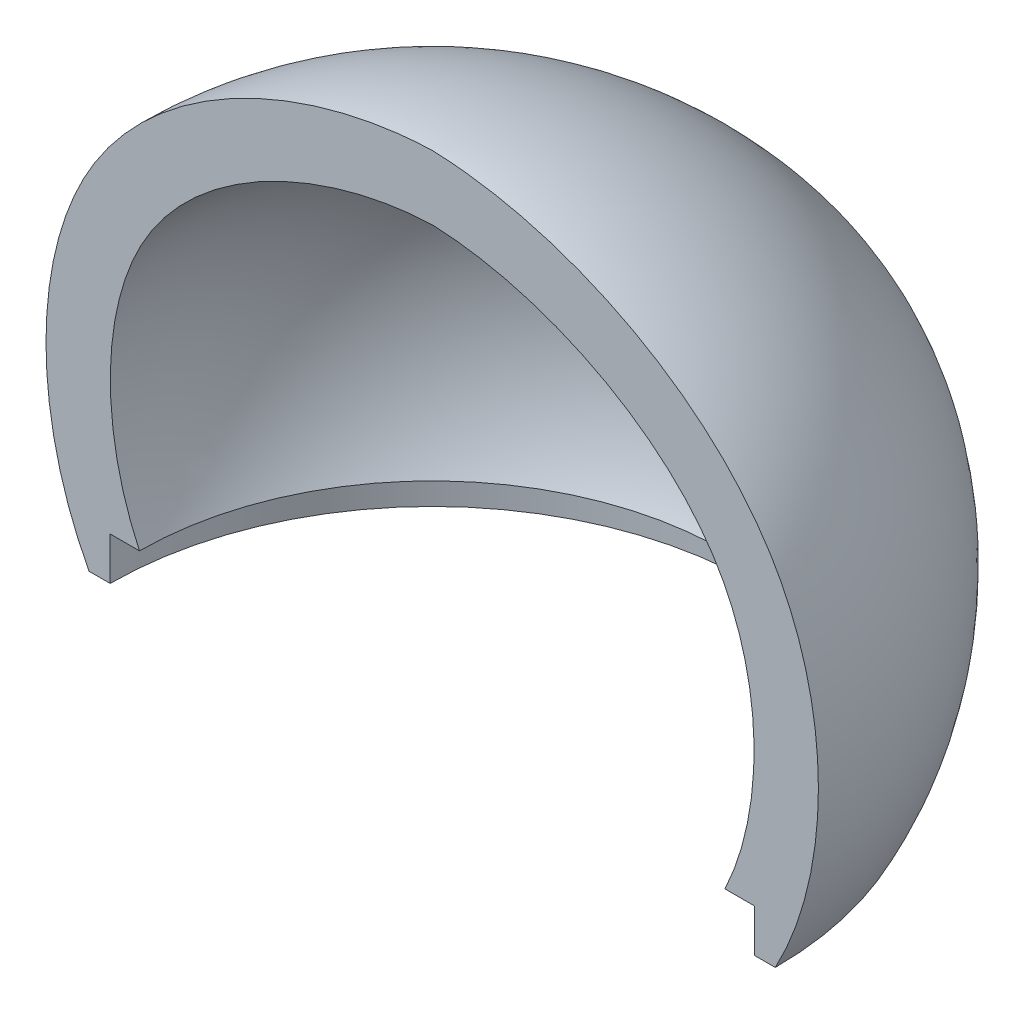
ISO-10303-21;
HEADER;
FILE_DESCRIPTION(('STEP AP214'),'2;1');
FILE_NAME('part.step','',(''),(''),'','','');
FILE_SCHEMA(('AUTOMOTIVE_DESIGN { 1 0 10303 214 1 1 1 1 }'));
ENDSEC;
DATA;
#1=APPLICATION_CONTEXT('core data for automotive mechanical design processes');
#2=APPLICATION_PROTOCOL_DEFINITION('international standard','automotive_design',2000,#1);
#3=PRODUCT_CONTEXT('',#1,'mechanical');
#4=PRODUCT('Part','Part','',(#3));
#5=PRODUCT_RELATED_PRODUCT_CATEGORY('part','',(#4));
#6=PRODUCT_DEFINITION_FORMATION('','',#4);
#7=PRODUCT_DEFINITION_CONTEXT('part definition',#1,'design');
#8=PRODUCT_DEFINITION('design','',#6,#7);
#9=PRODUCT_DEFINITION_SHAPE('','',#8);
#10=(LENGTH_UNIT() NAMED_UNIT(*) SI_UNIT(.MILLI.,.METRE.));
#11=(NAMED_UNIT(*) PLANE_ANGLE_UNIT() SI_UNIT($,.RADIAN.));
#12=(NAMED_UNIT(*) SI_UNIT($,.STERADIAN.) SOLID_ANGLE_UNIT());
#13=UNCERTAINTY_MEASURE_WITH_UNIT(LENGTH_MEASURE(1.E-05),#10,'distance_accuracy_value','');
#14=(GEOMETRIC_REPRESENTATION_CONTEXT(3) GLOBAL_UNCERTAINTY_ASSIGNED_CONTEXT((#13)) GLOBAL_UNIT_ASSIGNED_CONTEXT((#10,
#11,#12)) REPRESENTATION_CONTEXT('',''));
#15=CARTESIAN_POINT('',(0.,0.,0.));
#16=DIRECTION('',(0.,0.,1.));
#17=DIRECTION('',(1.,0.,0.));
#18=AXIS2_PLACEMENT_3D('',#15,#16,#17);
#19=CARTESIAN_POINT('',(76.1464211262525,-7.13116958075435,0.));
#20=CARTESIAN_POINT('',(77.4309474175017,-4.75411305383624,0.));
#21=CARTESIAN_POINT('',(78.7154737087508,-2.37705652691813,0.));
#22=CARTESIAN_POINT('',(92.7645337126414,23.6211733316833,0.));
#23=CARTESIAN_POINT('',(95.1000959715982,93.5311801637914,0.));
#24=CARTESIAN_POINT('',(30.7783878588982,123.861878931378,0.));
#25=CARTESIAN_POINT('',(0.555109225954513,124.981127008044,0.));
#26=B_SPLINE_CURVE_WITH_KNOTS('',3,(#19,#20,#21,#22,#23,#24,#25),.UNSPECIFIED.,.F.,.F.,(4,2,1,
4),(-0.0466657128766658,0.,0.463724307783053,0.996733952716112),.UNSPECIFIED.);
#27=CARTESIAN_POINT('',(0.,0.,0.));
#28=DIRECTION('',(0.,-1.,0.));
#29=AXIS1_PLACEMENT('',#27,#28);
#30=SURFACE_OF_REVOLUTION('',#26,#29);
#31=OFFSET_SURFACE('',#30,15.,.F.);
#32=CARTESIAN_POINT('',(62.9499662838242,1.59395066590129E-10,0.));
#33=CARTESIAN_POINT('',(63.1743469161339,0.415224008733973,0.));
#34=CARTESIAN_POINT('',(63.3987278963617,0.830447832946261,0.));
#35=CARTESIAN_POINT('',(63.8474898568059,1.66089548134995,0.));
#36=CARTESIAN_POINT('',(64.0718708370224,2.07611930554136,0.));
#37=CARTESIAN_POINT('',(64.5206321018813,2.9065673231334,0.));
#38=CARTESIAN_POINT('',(64.7450123865238,3.32179151653404,0.));
#39=CARTESIAN_POINT('',(65.1937757389895,4.1522384281357,0.));
#40=CARTESIAN_POINT('',(65.4181588068127,4.56746114633672,0.));
#41=CARTESIAN_POINT('',(65.7547255803837,5.19029937177134,0.));
#42=CARTESIAN_POINT('',(65.8669132002085,5.39791280492926,0.));
#43=CARTESIAN_POINT('',(66.0913027045851,5.81313211255979,0.));
#44=CARTESIAN_POINT('',(66.203504589137,6.0207379870324,0.));
#45=CARTESIAN_POINT('',(66.4278539088263,6.43597858820396,0.));
#46=CARTESIAN_POINT('',(66.5400013439638,6.64361331490285,0.));
#47=CARTESIAN_POINT('',(66.7521127779384,7.03586787762474,0.));
#48=CARTESIAN_POINT('',(66.8520555558022,7.22049895867559,0.));
#49=CARTESIAN_POINT('',(67.1295297965138,7.74001241472577,0.));
#50=CARTESIAN_POINT('',(67.3047247062041,8.07614854751027,0.));
#51=CARTESIAN_POINT('',(67.650096734582,8.7538535348669,0.));
#52=CARTESIAN_POINT('',(67.8202317839659,9.09544377109055,0.));
#53=CARTESIAN_POINT('',(68.155254421828,9.7839570021074,0.));
#54=CARTESIAN_POINT('',(68.3201003996894,10.1309002645467,0.));
#55=CARTESIAN_POINT('',(68.6444822189786,10.8299103124077,0.));
#56=CARTESIAN_POINT('',(68.8039780956198,11.181995602601,0.));
#57=CARTESIAN_POINT('',(69.2757301225001,12.2487872832044,0.));
#58=CARTESIAN_POINT('',(69.5782380292002,12.9678317870079,0.));
#59=CARTESIAN_POINT('',(70.1610472665371,14.4240653455075,0.));
#60=CARTESIAN_POINT('',(70.4410660664119,15.1613671167882,0.));
#61=CARTESIAN_POINT('',(70.9782264383545,16.6525564493128,0.));
#62=CARTESIAN_POINT('',(71.2351123974831,17.4065360620034,0.));
#63=CARTESIAN_POINT('',(71.7253737661809,18.9294472537558,0.));
#64=CARTESIAN_POINT('',(71.9585214001996,19.6984520803512,0.));
#65=CARTESIAN_POINT('',(72.4007246221364,21.2497527760559,0.));
#66=CARTESIAN_POINT('',(72.6095810073882,22.0321053851085,0.));
#67=CARTESIAN_POINT('',(73.0026689718122,23.6084094768856,0.));
#68=CARTESIAN_POINT('',(73.1867303775161,24.4024033634218,0.));
#69=CARTESIAN_POINT('',(73.5297453924402,26.0002755501579,0.));
#70=CARTESIAN_POINT('',(73.6885581382362,26.8041840691707,0.));
#71=CARTESIAN_POINT('',(73.9806421346715,28.4201532423677,0.));
#72=CARTESIAN_POINT('',(74.1138019756996,29.2322340220235,0.));
#73=CARTESIAN_POINT('',(74.3541955061179,30.8628025748079,0.));
#74=CARTESIAN_POINT('',(74.4613472837476,31.6813024188299,0.));
#75=CARTESIAN_POINT('',(74.6493887301634,33.3229553823508,0.));
#76=CARTESIAN_POINT('',(74.7302259514858,34.1461145079906,0.));
#77=CARTESIAN_POINT('',(74.8653507764283,35.7953278625379,0.));
#78=CARTESIAN_POINT('',(74.9196152969518,36.62138398295,0.));
#79=CARTESIAN_POINT('',(75.0013555055381,38.2746327255802,0.));
#80=CARTESIAN_POINT('',(75.0288373081058,39.1018250451986,0.));
#81=CARTESIAN_POINT('',(75.0568211124415,40.7555912531972,0.));
#82=CARTESIAN_POINT('',(75.0573581815399,41.5821645453014,0.));
#83=CARTESIAN_POINT('',(75.0313098257691,43.2329457550874,0.));
#84=CARTESIAN_POINT('',(75.0047880758383,44.0571546700033,0.));
#85=CARTESIAN_POINT('',(74.924527708335,45.7014728667561,0.));
#86=CARTESIAN_POINT('',(74.8708808940352,46.5215866154694,0.));
#87=CARTESIAN_POINT('',(74.7363243086476,48.1559981092652,0.));
#88=CARTESIAN_POINT('',(74.6555338110032,48.9703056512021,0.));
#89=CARTESIAN_POINT('',(74.4666918061337,50.5914121094555,0.));
#90=CARTESIAN_POINT('',(74.3587861485058,51.398227982825,0.));
#91=CARTESIAN_POINT('',(74.1157631767253,53.0026888504283,0.));
#92=CARTESIAN_POINT('',(73.9808170904687,53.8003597351439,0.));
#93=CARTESIAN_POINT('',(73.683808774792,55.3849062203507,0.));
#94=CARTESIAN_POINT('',(73.5219415703777,56.171818318067,0.));
#95=CARTESIAN_POINT('',(73.1712306177323,57.7332691003559,0.));
#96=CARTESIAN_POINT('',(72.9826036375046,58.5078563991726,0.));
#97=CARTESIAN_POINT('',(72.5785534122132,60.0431349825995,0.));
#98=CARTESIAN_POINT('',(72.3633660561028,60.803888259438,0.));
#99=CARTESIAN_POINT('',(71.9064116538434,62.3100421796678,0.));
#100=CARTESIAN_POINT('',(71.6648963232336,63.0555190867524,0.));
#101=CARTESIAN_POINT('',(71.1555304739888,64.5297395038376,0.));
#102=CARTESIAN_POINT('',(70.8879434532137,65.2585739391314,0.));
#103=CARTESIAN_POINT('',(70.3267035613011,66.6982194022596,0.));
#104=CARTESIAN_POINT('',(70.0333210229289,67.4091356801478,0.));
#105=CARTESIAN_POINT('',(69.4207505211794,68.8117433437723,0.));
#106=CARTESIAN_POINT('',(69.1018340790509,69.5035531860915,0.));
#107=CARTESIAN_POINT('',(68.4385134130702,70.8668948717079,0.));
#108=CARTESIAN_POINT('',(68.0943745694293,71.5385556447385,0.));
#109=CARTESIAN_POINT('',(67.3794641397437,72.8627522838576,0.));
#110=CARTESIAN_POINT('',(67.0088508397462,73.5153735560479,0.));
#111=CARTESIAN_POINT('',(66.2382256881988,74.8078434860594,0.));
#112=CARTESIAN_POINT('',(65.8380643221729,75.4476029128579,0.));
#113=CARTESIAN_POINT('',(65.0087783086797,76.7147603590885,0.));
#114=CARTESIAN_POINT('',(64.5794628161409,77.3420333539926,0.));
#115=CARTESIAN_POINT('',(63.6924160117424,78.5839840844964,0.));
#116=CARTESIAN_POINT('',(63.2344792289158,79.1985149348149,0.));
#117=CARTESIAN_POINT('',(62.2908360917231,80.4146661106541,0.));
#118=CARTESIAN_POINT('',(61.8049184145321,81.0161223117374,0.));
#119=CARTESIAN_POINT('',(60.8060163918281,82.2057161491283,0.));
#120=CARTESIAN_POINT('',(60.2928216746599,82.7936769785662,0.));
#121=CARTESIAN_POINT('',(59.2401435655804,83.9558048899814,0.));
#122=CARTESIAN_POINT('',(58.7004562101608,84.5297870559406,0.));
#123=CARTESIAN_POINT('',(57.5956438712514,85.6634296404021,0.));
#124=CARTESIAN_POINT('',(57.030325438299,86.2229013701027,0.));
#125=CARTESIAN_POINT('',(55.8751753267457,87.32695773986,0.));
#126=CARTESIAN_POINT('',(55.285163682958,87.8713539332964,0.));
#127=CARTESIAN_POINT('',(54.0816219868023,88.9446694996468,0.));
#128=CARTESIAN_POINT('',(53.4679274523199,89.4734042910445,0.));
#129=CARTESIAN_POINT('',(52.2180817388353,90.5147940145766,0.));
#130=CARTESIAN_POINT('',(51.5817827649267,91.0272714349065,0.));
#131=CARTESIAN_POINT('',(50.2878514731023,92.0355399450767,0.));
#132=CARTESIAN_POINT('',(49.6300886048017,92.5311633860151,0.));
#133=CARTESIAN_POINT('',(48.2944123081698,93.505119614265,0.));
#134=CARTESIAN_POINT('',(47.6163856531541,93.9832969988468,0.));
#135=CARTESIAN_POINT('',(46.2414078847062,94.9217728092516,0.));
#136=CARTESIAN_POINT('',(45.5443604861434,95.3819301585859,0.));
#137=CARTESIAN_POINT('',(44.1326474326413,96.2837691300594,0.));
#138=CARTESIAN_POINT('',(43.4179020361682,96.7253255795301,0.));
#139=CARTESIAN_POINT('',(41.2443792443798,98.0243508337316,0.));
#140=CARTESIAN_POINT('',(39.7661264583875,98.8494974136909,0.));
#141=CARTESIAN_POINT('',(36.7557676211277,100.41979973112,0.));
#142=CARTESIAN_POINT('',(35.2233751926605,101.164403836582,0.));
#143=CARTESIAN_POINT('',(32.116001697538,102.569725610488,0.));
#144=CARTESIAN_POINT('',(30.5409239217712,103.230229373063,0.));
#145=CARTESIAN_POINT('',(27.3600406878778,104.463770362798,0.));
#146=CARTESIAN_POINT('',(25.7542929410055,105.036956549457,0.));
#147=CARTESIAN_POINT('',(22.524252764872,106.092741505947,0.));
#148=CARTESIAN_POINT('',(20.9001359676461,106.575877558721,0.));
#149=CARTESIAN_POINT('',(17.6458758239545,107.448909276531,0.));
#150=CARTESIAN_POINT('',(16.0159887872407,107.839759175399,0.));
#151=CARTESIAN_POINT('',(12.7630236831126,108.526033228206,0.));
#152=CARTESIAN_POINT('',(11.1402428268581,108.822863641021,0.));
#153=CARTESIAN_POINT('',(7.91454302293814,109.319620682688,0.));
#154=CARTESIAN_POINT('',(6.31191903050036,109.521445092924,0.));
#155=CARTESIAN_POINT('',(3.14007991958934,109.826856332185,0.));
#156=CARTESIAN_POINT('',(1.57109918399959,109.932894964379,0.));
#157=CARTESIAN_POINT('',(-1.8459593662673E-10,109.991402069038,0.));
#158=B_SPLINE_CURVE_WITH_KNOTS('',3,(#32,#33,#34,#35,#36,#37,#38,#39,#40,#41,#42,#43,#44,#45,
#46,#47,#48,#49,#50,#51,#52,#53,#54,#55,#56,#57,#58,#59,#60,#61,#62,#63,#64,#65,#66,#67,#68,#69,
#70,#71,#72,#73,#74,#75,#76,#77,#78,#79,#80,#81,#82,#83,#84,#85,#86,#87,#88,#89,#90,#91,#92,#93,
#94,#95,#96,#97,#98,#99,#100,#101,#102,#103,#104,#105,#106,#107,#108,#109,#110,#111,#112,#113,
#114,#115,#116,#117,#118,#119,#120,#121,#122,#123,#124,#125,#126,#127,#128,#129,#130,#131,#132,
#133,#134,#135,#136,#137,#138,#139,#140,#141,#142,#143,#144,#145,#146,#147,#148,#149,#150,#151,
#152,#153,#154,#155,#156,#157),.UNSPECIFIED.,.F.,.F.,(4,2,2,2,2,2,2,2,2,2,2,2,2,2,2,2,2,2,2,2,2,
2,2,2,2,2,2,2,2,2,2,2,2,2,2,2,2,2,2,2,2,2,2,2,2,2,2,2,2,2,2,2,2,2,2,2,2,2,2,2,2,2,4),(0.,
1.41591625008182,2.83183250009244,4.24774875175578,5.66366500239148,6.37162312764702,
7.07958125347646,7.78753937769992,8.41737262659218,9.55444851739848,10.6992330523788,
11.8515068180399,13.0110349461876,15.3507522888523,17.7163406040598,20.105488303157,
22.5157448069944,24.9445490178416,27.3892548413694,29.8471543251772,32.3154989405096,
34.7915195073288,37.2724452308286,39.7555222714118,42.2380322916468,44.7173113554216,
47.1907695945563,49.6559120321322,52.1103609309377,54.5518800972141,56.9784014635185,
59.3880543568867,61.7791977766695,64.1504559241853,66.5007572120357,68.8293767686183,
71.1359823196093,73.4206830614241,75.6840807808514,77.9349260090721,80.1980650217408,
82.4777971987917,84.7763650384096,87.0954425100218,89.4361747890853,91.7992200956671,
94.184792049475,96.5927012685204,99.0223953050522,101.472996270709,103.943335788093,
106.43198706336,108.937294068252,111.457397872157,116.5331537444,121.641724557456,
126.763039740117,131.875517940473,136.956441183302,141.982270076886,146.928926528148,
151.772071934714,156.487413900511),.UNSPECIFIED.);
#159=CARTESIAN_POINT('',(-1.17845743745001E-05,109.991401632615,0.));
#160=VERTEX_POINT('',#159);
#161=CARTESIAN_POINT('',(68.2569066165496,9.99999999999998,0.));
#162=VERTEX_POINT('',#161);
#163=EDGE_CURVE('E13',#160,#162,#158,.F.);
#164=ORIENTED_EDGE('',*,*,#163,.F.);
#165=CARTESIAN_POINT('',(-68.2569066165496,9.99999999999997,0.));
#166=CARTESIAN_POINT('',(-68.6665460328824,10.8637595467649,0.));
#167=CARTESIAN_POINT('',(-69.0565170834825,11.736757952683,0.));
#168=CARTESIAN_POINT('',(-69.7975835282926,13.4981139379088,0.));
#169=CARTESIAN_POINT('',(-70.1487164131711,14.3864557310977,0.));
#170=CARTESIAN_POINT('',(-70.81320969117,16.1766601616602,0.));
#171=CARTESIAN_POINT('',(-71.1265873505218,17.0785164048011,0.));
#172=CARTESIAN_POINT('',(-71.71639133955,18.894076485001,0.));
#173=CARTESIAN_POINT('',(-71.9928229240774,19.8077786168931,0.));
#174=CARTESIAN_POINT('',(-72.509355565391,21.645408318941,0.));
#175=CARTESIAN_POINT('',(-72.749455619219,22.5693361706299,0.));
#176=CARTESIAN_POINT('',(-73.1951845533783,24.4317681378412,0.));
#177=CARTESIAN_POINT('',(-73.4005809322806,25.3703278448171,0.));
#178=CARTESIAN_POINT('',(-73.7753498113488,27.2547745698721,0.));
#179=CARTESIAN_POINT('',(-73.9447160394433,28.200662834041,0.));
#180=CARTESIAN_POINT('',(-74.247581386569,30.0982728908438,0.));
#181=CARTESIAN_POINT('',(-74.3810763212114,31.0499953508043,0.));
#182=CARTESIAN_POINT('',(-74.6122302083485,32.9577977782478,0.));
#183=CARTESIAN_POINT('',(-74.7098885434694,33.9138778205136,0.));
#184=CARTESIAN_POINT('',(-74.8692847527654,35.828930255142,0.));
#185=CARTESIAN_POINT('',(-74.9310261506384,36.787902354492,0.));
#186=CARTESIAN_POINT('',(-75.0209370927853,38.7631457013482,0.));
#187=CARTESIAN_POINT('',(-75.0469529124643,39.7795158275493,0.));
#188=CARTESIAN_POINT('',(-75.0581808661325,41.812251232677,0.));
#189=CARTESIAN_POINT('',(-75.0434023495469,42.828616459338,0.));
#190=CARTESIAN_POINT('',(-74.9725208669183,44.859801745928,0.));
#191=CARTESIAN_POINT('',(-74.9164224975064,45.874621965149,0.));
#192=CARTESIAN_POINT('',(-74.7622038956399,47.9011666379843,0.));
#193=CARTESIAN_POINT('',(-74.6640799754347,48.9128908120713,0.));
#194=CARTESIAN_POINT('',(-74.425296015462,50.9285102500403,0.));
#195=CARTESIAN_POINT('',(-74.284753296151,51.9324193713617,0.));
#196=CARTESIAN_POINT('',(-73.9600571487519,53.9332513591586,0.));
#197=CARTESIAN_POINT('',(-73.775900780005,54.9301737498838,0.));
#198=CARTESIAN_POINT('',(-73.3629105041067,56.9146537479373,0.));
#199=CARTESIAN_POINT('',(-73.1340802931793,57.9022121229421,0.));
#200=CARTESIAN_POINT('',(-72.6305395284899,59.865592047951,0.));
#201=CARTESIAN_POINT('',(-72.3558299002387,60.8414138342879,0.));
#202=CARTESIAN_POINT('',(-71.8213545768955,62.576991543766,0.));
#203=CARTESIAN_POINT('',(-71.5703711198684,63.3394606240486,0.));
#204=CARTESIAN_POINT('',(-71.0382378373502,64.8537265021779,0.));
#205=CARTESIAN_POINT('',(-70.7570915159067,65.6055245282256,0.));
#206=CARTESIAN_POINT('',(-70.1640601829126,67.0967030814452,0.));
#207=CARTESIAN_POINT('',(-69.852182584271,67.8360865531002,0.));
#208=CARTESIAN_POINT('',(-69.1971079631038,69.3007041874974,0.));
#209=CARTESIAN_POINT('',(-68.8539166718201,70.0259409100963,0.));
#210=CARTESIAN_POINT('',(-68.1361928512016,71.459353847708,0.));
#211=CARTESIAN_POINT('',(-67.7617098782196,72.1675548340043,0.));
#212=CARTESIAN_POINT('',(-66.9805237727047,73.5660916149724,0.));
#213=CARTESIAN_POINT('',(-66.5738159966715,74.256424815865,0.));
#214=CARTESIAN_POINT('',(-65.7300412085148,75.6183873140543,0.));
#215=CARTESIAN_POINT('',(-65.2929701258874,76.2900140865946,0.));
#216=CARTESIAN_POINT('',(-64.3903945839287,77.6138039173025,0.));
#217=CARTESIAN_POINT('',(-63.9248912753132,78.2659677615902,0.));
#218=CARTESIAN_POINT('',(-62.8109546626273,79.7600856876454,0.));
#219=CARTESIAN_POINT('',(-62.1524027076531,80.5945147875347,0.));
#220=CARTESIAN_POINT('',(-60.7926558330874,82.2277375132228,0.));
#221=CARTESIAN_POINT('',(-60.0914617075997,83.0265318021509,0.));
#222=CARTESIAN_POINT('',(-58.6503168646937,84.5882649565765,0.));
#223=CARTESIAN_POINT('',(-57.9103672907327,85.3512048786777,0.));
#224=CARTESIAN_POINT('',(-56.3930636702663,86.8434654743058,0.));
#225=CARTESIAN_POINT('',(-55.6156056762398,87.5726802810959,0.));
#226=CARTESIAN_POINT('',(-54.0286393727496,88.9952771060551,0.));
#227=CARTESIAN_POINT('',(-53.2191316947527,89.6886598295949,0.));
#228=CARTESIAN_POINT('',(-51.5709590255208,91.0400040892791,0.));
#229=CARTESIAN_POINT('',(-50.7322905395615,91.6979613556764,0.));
#230=CARTESIAN_POINT('',(-48.9052689847432,93.0714538470085,0.));
#231=CARTESIAN_POINT('',(-47.9128187706791,93.7815412389839,0.));
#232=CARTESIAN_POINT('',(-45.896835346894,95.1563703995503,0.));
#233=CARTESIAN_POINT('',(-44.8732975296979,95.821105398628,0.));
#234=CARTESIAN_POINT('',(-42.7979853027781,97.105960121527,0.));
#235=CARTESIAN_POINT('',(-41.7461984290386,97.7260596921002,0.));
#236=CARTESIAN_POINT('',(-39.6177069671768,98.9217368836315,0.));
#237=CARTESIAN_POINT('',(-38.5410035398342,99.4973165732205,0.));
#238=CARTESIAN_POINT('',(-36.3662077259847,100.60376304045,0.));
#239=CARTESIAN_POINT('',(-35.2681372865222,101.134672994545,0.));
#240=CARTESIAN_POINT('',(-33.0517925941608,102.152576670574,0.));
#241=CARTESIAN_POINT('',(-31.9335176347419,102.639568853191,0.));
#242=CARTESIAN_POINT('',(-29.6793837871521,103.569346260219,0.));
#243=CARTESIAN_POINT('',(-28.5435336686325,104.012152759847,0.));
#244=CARTESIAN_POINT('',(-26.2556804072017,104.853527419501,0.));
#245=CARTESIAN_POINT('',(-25.1036788351782,105.252099848568,0.));
#246=CARTESIAN_POINT('',(-22.9851773591185,105.939624561642,0.));
#247=CARTESIAN_POINT('',(-22.0209578774552,106.23562627176,0.));
#248=CARTESIAN_POINT('',(-20.0836615903063,106.796537038863,0.));
#249=CARTESIAN_POINT('',(-19.110586123292,107.061450713006,0.));
#250=CARTESIAN_POINT('',(-17.1574086457351,107.559386745977,0.));
#251=CARTESIAN_POINT('',(-16.1773152042617,107.792442706991,0.));
#252=CARTESIAN_POINT('',(-14.2099396820664,108.226265147865,0.));
#253=CARTESIAN_POINT('',(-13.2226571701784,108.427029674087,0.));
#254=CARTESIAN_POINT('',(-11.2254607492496,108.798382017355,0.));
#255=CARTESIAN_POINT('',(-10.2154431888771,108.968413671725,0.));
#256=CARTESIAN_POINT('',(-8.19013907951737,109.27292158933,0.));
#257=CARTESIAN_POINT('',(-7.17485295239137,109.407400655848,0.));
#258=CARTESIAN_POINT('',(-5.13534312890622,109.639906308636,0.));
#259=CARTESIAN_POINT('',(-4.1110998007149,109.737762602382,0.));
#260=CARTESIAN_POINT('',(-2.57189247539816,109.855258116048,0.));
#261=CARTESIAN_POINT('',(-2.05801595897326,109.889554500494,0.));
#262=CARTESIAN_POINT('',(-1.28668530095257,109.933456347897,0.));
#263=CARTESIAN_POINT('',(-1.02944487500083,109.946834825089,0.));
#264=CARTESIAN_POINT('',(-0.643483688150569,109.964989125789,0.));
#265=CARTESIAN_POINT('',(-0.514807496218346,109.970721868501,0.));
#266=CARTESIAN_POINT('',(-0.32177155725272,109.978839139564,0.));
#267=CARTESIAN_POINT('',(-0.257421910903318,109.981464616273,0.));
#268=CARTESIAN_POINT('',(-0.160892490029522,109.985281935074,0.));
#269=CARTESIAN_POINT('',(-0.128715099818867,109.986534228681,0.));
#270=CARTESIAN_POINT('',(-0.080447833345048,109.988382390481,0.));
#271=CARTESIAN_POINT('',(-0.0643585361927745,109.988993398404,0.));
#272=CARTESIAN_POINT('',(-0.0402243024293729,109.989902333827,0.));
#273=CARTESIAN_POINT('',(-0.0321795083992222,109.99020404961,0.));
#274=CARTESIAN_POINT('',(-0.0201122462421591,109.990654728317,0.));
#275=CARTESIAN_POINT('',(-0.0160898134914115,109.990804638732,0.));
#276=CARTESIAN_POINT('',(-0.0100561467006465,109.991029030505,0.));
#277=CARTESIAN_POINT('',(-0.00804492147047101,109.991103748789,0.));
#278=CARTESIAN_POINT('',(-0.00502807922310439,109.991215707739,0.));
#279=CARTESIAN_POINT('',(-0.00402246440414579,109.991253007644,0.));
#280=CARTESIAN_POINT('',(-0.00251404107697064,109.99130892788,0.));
#281=CARTESIAN_POINT('',(-0.00201123311777662,109.991327563022,0.));
#282=CARTESIAN_POINT('',(-0.00100954502194605,109.991364677883,0.));
#283=CARTESIAN_POINT('',(-0.000510664888156519,109.99138315768,0.));
#284=CARTESIAN_POINT('',(-1.1784574372657E-05,109.991401632616,0.));
#285=B_SPLINE_CURVE_WITH_KNOTS('',3,(#165,#166,#167,#168,#169,#170,#171,#172,#173,#174,#175,
#176,#177,#178,#179,#180,#181,#182,#183,#184,#185,#186,#187,#188,#189,#190,#191,#192,#193,#194,
#195,#196,#197,#198,#199,#200,#201,#202,#203,#204,#205,#206,#207,#208,#209,#210,#211,#212,#213,
#214,#215,#216,#217,#218,#219,#220,#221,#222,#223,#224,#225,#226,#227,#228,#229,#230,#231,#232,
#233,#234,#235,#236,#237,#238,#239,#240,#241,#242,#243,#244,#245,#246,#247,#248,#249,#250,#251,
#252,#253,#254,#255,#256,#257,#258,#259,#260,#261,#262,#263,#264,#265,#266,#267,#268,#269,#270,
#271,#272,#273,#274,#275,#276,#277,#278,#279,#280,#281,#282,#283,#284),.UNSPECIFIED.,.F.,.F.,(4,
2,2,2,2,2,2,2,2,2,2,2,2,2,2,2,2,2,2,2,2,2,2,2,2,2,2,2,2,2,2,2,2,2,2,2,2,2,2,2,2,2,2,2,2,2,2,2,2,
2,2,2,2,2,2,2,2,2,2,4),(0.,2.86755573273369,5.73231878703114,8.59576671354601,11.458806936637,
14.3219261816087,17.2035257752883,20.0856265835002,22.96806344315,25.8505499575547,
28.7327536325618,31.7820443852909,34.830636346196,37.8788892173919,40.9274096282095,
43.9675746291779,47.0079446722474,50.0480632677276,53.0881205432719,55.4956764220032,
57.9029529150082,60.3096501467318,62.7159077688206,65.1184243372626,67.5212877331694,
69.9244738808239,72.3275628305308,75.5149483249835,78.7022744805262,81.8895066487656,
85.0861453714429,88.2827211428747,91.4796813315642,95.1393137351006,98.7994912030161,
102.461311036433,106.122960619859,109.781029298154,113.439226141825,117.095652993003,
120.751726654251,123.777123929,126.802071305109,129.823803059603,132.845717560805,
135.917788184187,138.989616505851,142.075556127964,143.620528146631,144.393279645771,
144.779689647267,144.972899000044,145.069504224973,145.117806906293,145.141958255578,
145.1540339313,145.160071769295,145.16309068831,145.16460014782,145.166097814677),.UNSPECIFIED.);
#286=CARTESIAN_POINT('',(-68.2569066165496,9.99999999999998,0.));
#287=VERTEX_POINT('',#286);
#288=EDGE_CURVE('E755',#287,#160,#285,.T.);
#289=ORIENTED_EDGE('',*,*,#288,.F.);
#290=CARTESIAN_POINT('',(0.,9.99999999999998,0.));
#291=DIRECTION('',(0.,-1.,0.));
#292=DIRECTION('',(0.,0.,-1.));
#293=AXIS2_PLACEMENT_3D('',#290,#291,#292);
#294=CIRCLE('',#293,68.2569066165496);
#295=EDGE_CURVE('E820',#162,#287,#294,.F.);
#296=ORIENTED_EDGE('',*,*,#295,.F.);
#297=EDGE_LOOP('',(#164,#289,#296));
#298=FACE_BOUND('',#297,.T.);
#299=ADVANCED_FACE('F745',(#298),#31,.T.);
#300=CARTESIAN_POINT('',(80.,0.,0.));
#301=CARTESIAN_POINT('',(92.7645337126414,23.6211733316833,0.));
#302=CARTESIAN_POINT('',(95.1077490236001,93.7602577298846,0.));
#303=CARTESIAN_POINT('',(30.356139929725,124.060226156978,0.));
#304=CARTESIAN_POINT('',(0.,125.,0.));
#305=B_SPLINE_CURVE_WITH_KNOTS('',3,(#300,#301,#302,#303,#304),.UNSPECIFIED.,.F.,.F.,(4,1,4),
(0.,0.463724307783053,1.),.UNSPECIFIED.);
#306=CARTESIAN_POINT('',(0.,0.,0.));
#307=DIRECTION('',(0.,-1.,0.));
#308=AXIS1_PLACEMENT('',#306,#307);
#309=SURFACE_OF_REVOLUTION('',#305,#308);
#310=CARTESIAN_POINT('',(0.,0.,0.));
#311=DIRECTION('',(0.,-1.,0.));
#312=DIRECTION('',(0.,0.,-1.));
#313=AXIS2_PLACEMENT_3D('',#310,#311,#312);
#314=CIRCLE('',#313,80.);
#315=CARTESIAN_POINT('',(-80.,0.,0.));
#316=VERTEX_POINT('',#315);
#317=CARTESIAN_POINT('',(80.,0.,0.));
#318=VERTEX_POINT('',#317);
#319=EDGE_CURVE('E809',#316,#318,#314,.T.);
#320=ORIENTED_EDGE('',*,*,#319,.F.);
#321=CARTESIAN_POINT('',(-80.,0.,0.));
#322=CARTESIAN_POINT('',(-92.7645337126414,23.6211733316833,0.));
#323=CARTESIAN_POINT('',(-95.1077490236001,93.7602577298846,0.));
#324=CARTESIAN_POINT('',(-30.356139929725,124.060226156978,0.));
#325=CARTESIAN_POINT('',(0.,125.,0.));
#326=B_SPLINE_CURVE_WITH_KNOTS('',3,(#321,#322,#323,#324,#325),.UNSPECIFIED.,.F.,.F.,(4,1,4),
(0.,0.463724307783053,1.),.UNSPECIFIED.);
#327=CARTESIAN_POINT('',(0.,125.,0.));
#328=VERTEX_POINT('',#327);
#329=EDGE_CURVE('E850',#316,#328,#326,.T.);
#330=ORIENTED_EDGE('',*,*,#329,.T.);
#331=CARTESIAN_POINT('',(80.,0.,0.));
#332=CARTESIAN_POINT('',(92.7645337126414,23.6211733316833,0.));
#333=CARTESIAN_POINT('',(95.1077490236001,93.7602577298846,0.));
#334=CARTESIAN_POINT('',(30.356139929725,124.060226156978,0.));
#335=CARTESIAN_POINT('',(0.,125.,0.));
#336=B_SPLINE_CURVE_WITH_KNOTS('',3,(#331,#332,#333,#334,#335),.UNSPECIFIED.,.F.,.F.,(4,1,4),
(0.,0.463724307783053,1.),.UNSPECIFIED.);
#337=EDGE_CURVE('E811',#328,#318,#336,.F.);
#338=ORIENTED_EDGE('',*,*,#337,.T.);
#339=EDGE_LOOP('',(#320,#330,#338));
#340=FACE_BOUND('',#339,.T.);
#341=ADVANCED_FACE('F840',(#340),#309,.F.);
#342=CARTESIAN_POINT('',(0.,0.,0.));
#343=DIRECTION('',(0.,-1.,0.));
#344=DIRECTION('',(0.,0.,-1.));
#345=AXIS2_PLACEMENT_3D('',#342,#343,#344);
#346=PLANE('',#345);
#347=ORIENTED_EDGE('',*,*,#319,.T.);
#348=DIRECTION('',(-1.,0.,0.));
#349=VECTOR('',#348,1.);
#350=CARTESIAN_POINT('',(0.,0.,0.));
#351=LINE('',#350,#349);
#352=CARTESIAN_POINT('',(75.1,0.,0.));
#353=VERTEX_POINT('',#352);
#354=EDGE_CURVE('E794',#318,#353,#351,.T.);
#355=ORIENTED_EDGE('',*,*,#354,.T.);
#356=CARTESIAN_POINT('',(0.,0.,0.));
#357=DIRECTION('',(0.,-1.,0.));
#358=DIRECTION('',(0.,0.,-1.));
#359=AXIS2_PLACEMENT_3D('',#356,#357,#358);
#360=CIRCLE('',#359,75.1);
#361=CARTESIAN_POINT('',(-75.1,0.,0.));
#362=VERTEX_POINT('',#361);
#363=EDGE_CURVE('E807',#362,#353,#360,.T.);
#364=ORIENTED_EDGE('',*,*,#363,.F.);
#365=EDGE_CURVE('E813',#362,#316,#351,.T.);
#366=ORIENTED_EDGE('',*,*,#365,.T.);
#367=EDGE_LOOP('',(#347,#355,#364,#366));
#368=FACE_BOUND('',#367,.T.);
#369=ADVANCED_FACE('F747',(#368),#346,.T.);
#370=CARTESIAN_POINT('',(0.,10.,0.));
#371=DIRECTION('',(0.,-1.,0.));
#372=DIRECTION('',(0.,0.,-1.));
#373=AXIS2_PLACEMENT_3D('',#370,#371,#372);
#374=PLANE('',#373);
#375=CARTESIAN_POINT('',(0.,10.,0.));
#376=DIRECTION('',(0.,-1.,0.));
#377=DIRECTION('',(0.,0.,-1.));
#378=AXIS2_PLACEMENT_3D('',#375,#376,#377);
#379=CIRCLE('',#378,75.1);
#380=CARTESIAN_POINT('',(-75.1,10.,0.));
#381=VERTEX_POINT('',#380);
#382=CARTESIAN_POINT('',(75.1,10.,0.));
#383=VERTEX_POINT('',#382);
#384=EDGE_CURVE('E816',#381,#383,#379,.T.);
#385=ORIENTED_EDGE('',*,*,#384,.T.);
#386=DIRECTION('',(-1.,0.,0.));
#387=VECTOR('',#386,1.);
#388=CARTESIAN_POINT('',(0.,10.,0.));
#389=LINE('',#388,#387);
#390=EDGE_CURVE('E796',#383,#162,#389,.T.);
#391=ORIENTED_EDGE('',*,*,#390,.T.);
#392=ORIENTED_EDGE('',*,*,#295,.T.);
#393=EDGE_CURVE('E762',#287,#381,#389,.T.);
#394=ORIENTED_EDGE('',*,*,#393,.T.);
#395=EDGE_LOOP('',(#385,#391,#392,#394));
#396=FACE_BOUND('',#395,.T.);
#397=ADVANCED_FACE('F847',(#396),#374,.T.);
#398=CARTESIAN_POINT('',(0.,10.,0.));
#399=DIRECTION('',(0.,-1.,0.));
#400=DIRECTION('',(0.,0.,-1.));
#401=AXIS2_PLACEMENT_3D('',#398,#399,#400);
#402=CYLINDRICAL_SURFACE('',#401,75.1);
#403=DIRECTION('',(0.,-1.,0.));
#404=VECTOR('',#403,1.);
#405=CARTESIAN_POINT('',(-75.1,10.,0.));
#406=LINE('',#405,#404);
#407=EDGE_CURVE('E778',#362,#381,#406,.F.);
#408=ORIENTED_EDGE('',*,*,#407,.F.);
#409=ORIENTED_EDGE('',*,*,#363,.T.);
#410=DIRECTION('',(0.,-1.,0.));
#411=VECTOR('',#410,1.);
#412=CARTESIAN_POINT('',(75.1,10.,0.));
#413=LINE('',#412,#411);
#414=EDGE_CURVE('E791',#383,#353,#413,.T.);
#415=ORIENTED_EDGE('',*,*,#414,.F.);
#416=ORIENTED_EDGE('',*,*,#384,.F.);
#417=EDGE_LOOP('',(#408,#409,#415,#416));
#418=FACE_BOUND('',#417,.T.);
#419=ADVANCED_FACE('F814',(#418),#402,.F.);
#420=CARTESIAN_POINT('',(0.,0.,0.));
#421=DIRECTION('',(0.,0.,1.));
#422=DIRECTION('',(1.,0.,0.));
#423=AXIS2_PLACEMENT_3D('',#420,#421,#422);
#424=PLANE('',#423);
#425=ORIENTED_EDGE('',*,*,#163,.T.);
#426=ORIENTED_EDGE('',*,*,#390,.F.);
#427=ORIENTED_EDGE('',*,*,#414,.T.);
#428=ORIENTED_EDGE('',*,*,#354,.F.);
#429=ORIENTED_EDGE('',*,*,#337,.F.);
#430=ORIENTED_EDGE('',*,*,#329,.F.);
#431=ORIENTED_EDGE('',*,*,#365,.F.);
#432=ORIENTED_EDGE('',*,*,#407,.T.);
#433=ORIENTED_EDGE('',*,*,#393,.F.);
#434=ORIENTED_EDGE('',*,*,#288,.T.);
#435=EDGE_LOOP('',(#425,#426,#427,#428,#429,#430,#431,#432,#433,#434));
#436=FACE_BOUND('',#435,.T.);
#437=ADVANCED_FACE('F793',(#436),#424,.T.);
#438=CLOSED_SHELL('',(#299,#341,#369,#397,#419,#437));
#439=MANIFOLD_SOLID_BREP('B2',#438);
#440=ADVANCED_BREP_SHAPE_REPRESENTATION('',(#18,#439),#14);
#441=SHAPE_DEFINITION_REPRESENTATION(#9,#440);
ENDSEC;
END-ISO-10303-21;
